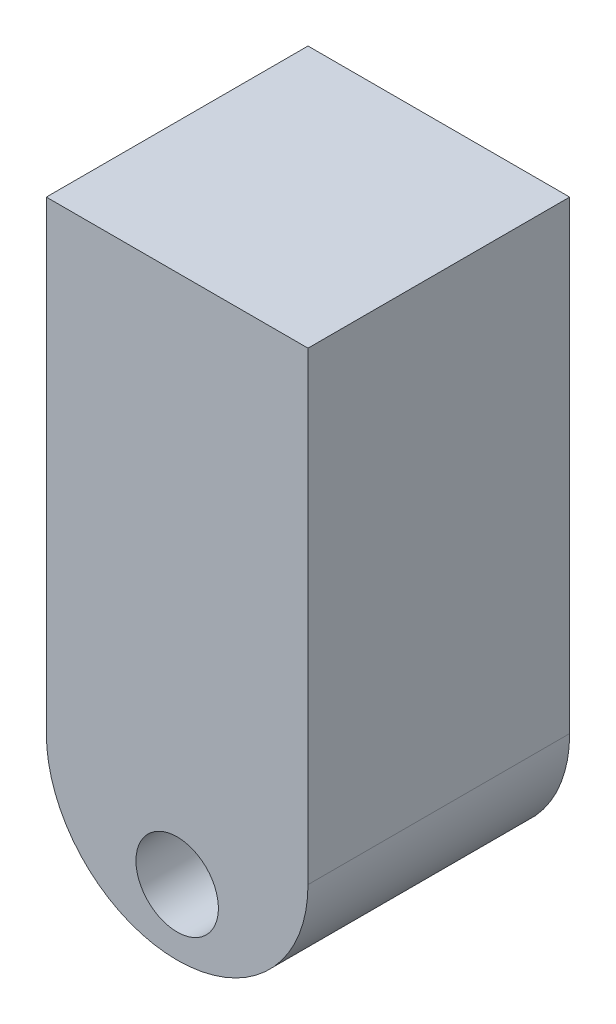
ISO-10303-21;
HEADER;
FILE_DESCRIPTION(('STEP AP214'),'2;1');
FILE_NAME('part.step','',(''),(''),'','','');
FILE_SCHEMA(('AUTOMOTIVE_DESIGN { 1 0 10303 214 1 1 1 1 }'));
ENDSEC;
DATA;
#1=APPLICATION_CONTEXT('core data for automotive mechanical design processes');
#2=APPLICATION_PROTOCOL_DEFINITION('international standard','automotive_design',2000,#1);
#3=PRODUCT_CONTEXT('',#1,'mechanical');
#4=PRODUCT('Part','Part','',(#3));
#5=PRODUCT_RELATED_PRODUCT_CATEGORY('part','',(#4));
#6=PRODUCT_DEFINITION_FORMATION('','',#4);
#7=PRODUCT_DEFINITION_CONTEXT('part definition',#1,'design');
#8=PRODUCT_DEFINITION('design','',#6,#7);
#9=PRODUCT_DEFINITION_SHAPE('','',#8);
#10=(LENGTH_UNIT() NAMED_UNIT(*) SI_UNIT(.MILLI.,.METRE.));
#11=(NAMED_UNIT(*) PLANE_ANGLE_UNIT() SI_UNIT($,.RADIAN.));
#12=(NAMED_UNIT(*) SI_UNIT($,.STERADIAN.) SOLID_ANGLE_UNIT());
#13=UNCERTAINTY_MEASURE_WITH_UNIT(LENGTH_MEASURE(1.E-05),#10,'distance_accuracy_value','');
#14=(GEOMETRIC_REPRESENTATION_CONTEXT(3) GLOBAL_UNCERTAINTY_ASSIGNED_CONTEXT((#13)) GLOBAL_UNIT_ASSIGNED_CONTEXT((#10,
#11,#12)) REPRESENTATION_CONTEXT('',''));
#15=CARTESIAN_POINT('',(0.,0.,0.));
#16=DIRECTION('',(0.,0.,1.));
#17=DIRECTION('',(1.,0.,0.));
#18=AXIS2_PLACEMENT_3D('',#15,#16,#17);
#19=CARTESIAN_POINT('',(-4.43730265788188,6.57084091920209,19.05));
#20=DIRECTION('',(0.,0.,1.));
#21=DIRECTION('',(1.,0.,0.));
#22=AXIS2_PLACEMENT_3D('',#19,#20,#21);
#23=PLANE('',#22);
#24=DIRECTION('',(0.,-1.,0.));
#25=VECTOR('',#24,1.);
#26=CARTESIAN_POINT('',(-13.9623026578819,14.9955130545651,19.05));
#27=LINE('',#26,#25);
#28=CARTESIAN_POINT('',(-13.9623026578819,40.3955130545651,19.05));
#29=VERTEX_POINT('',#28);
#30=CARTESIAN_POINT('',(-13.9623026578819,6.57084091920209,19.05));
#31=VERTEX_POINT('',#30);
#32=EDGE_CURVE('E93',#29,#31,#27,.T.);
#33=ORIENTED_EDGE('',*,*,#32,.T.);
#34=CARTESIAN_POINT('',(-4.43730265788188,6.57084091920209,19.05));
#35=DIRECTION('',(0.,0.,1.));
#36=DIRECTION('',(1.,0.,0.));
#37=AXIS2_PLACEMENT_3D('',#34,#35,#36);
#38=CIRCLE('',#37,9.525);
#39=CARTESIAN_POINT('',(5.08769734211812,6.57084091920209,19.05));
#40=VERTEX_POINT('',#39);
#41=EDGE_CURVE('E61',#31,#40,#38,.T.);
#42=ORIENTED_EDGE('',*,*,#41,.T.);
#43=DIRECTION('',(0.,1.,0.));
#44=VECTOR('',#43,1.);
#45=CARTESIAN_POINT('',(5.08769734211812,14.9955130545651,19.05));
#46=LINE('',#45,#44);
#47=CARTESIAN_POINT('',(5.08769734211812,40.3955130545651,19.05));
#48=VERTEX_POINT('',#47);
#49=EDGE_CURVE('E101',#40,#48,#46,.T.);
#50=ORIENTED_EDGE('',*,*,#49,.T.);
#51=DIRECTION('',(1.,0.,0.));
#52=VECTOR('',#51,1.);
#53=CARTESIAN_POINT('',(-13.9623026578819,40.3955130545651,19.05));
#54=LINE('',#53,#52);
#55=EDGE_CURVE('E98',#29,#48,#54,.T.);
#56=ORIENTED_EDGE('',*,*,#55,.F.);
#57=EDGE_LOOP('',(#33,#42,#50,#56));
#58=FACE_BOUND('',#57,.T.);
#59=CARTESIAN_POINT('',(-4.43730265788188,1.82006584794216,19.05));
#60=DIRECTION('',(0.,0.,1.));
#61=DIRECTION('',(1.,0.,0.));
#62=AXIS2_PLACEMENT_3D('',#59,#60,#61);
#63=CIRCLE('',#62,3.);
#64=CARTESIAN_POINT('',(-7.43730265788188,1.82006584794216,19.05));
#65=VERTEX_POINT('',#64);
#66=EDGE_CURVE('E111',#65,#65,#63,.T.);
#67=ORIENTED_EDGE('',*,*,#66,.F.);
#68=EDGE_LOOP('',(#67));
#69=FACE_BOUND('',#68,.T.);
#70=ADVANCED_FACE('F50',(#58,#69),#23,.T.);
#71=CARTESIAN_POINT('',(-4.43730265788188,6.57084091920209,0.));
#72=DIRECTION('',(0.,0.,1.));
#73=DIRECTION('',(1.,0.,0.));
#74=AXIS2_PLACEMENT_3D('',#71,#72,#73);
#75=PLANE('',#74);
#76=DIRECTION('',(0.,-1.,0.));
#77=VECTOR('',#76,1.);
#78=CARTESIAN_POINT('',(-13.9623026578819,14.9955130545651,0.));
#79=LINE('',#78,#77);
#80=CARTESIAN_POINT('',(-13.9623026578819,40.3955130545651,0.));
#81=VERTEX_POINT('',#80);
#82=CARTESIAN_POINT('',(-13.9623026578819,6.57084091920209,0.));
#83=VERTEX_POINT('',#82);
#84=EDGE_CURVE('E76',#81,#83,#79,.T.);
#85=ORIENTED_EDGE('',*,*,#84,.F.);
#86=DIRECTION('',(-1.,0.,0.));
#87=VECTOR('',#86,1.);
#88=CARTESIAN_POINT('',(-13.9623026578819,40.3955130545651,0.));
#89=LINE('',#88,#87);
#90=CARTESIAN_POINT('',(5.08769734211812,40.3955130545651,0.));
#91=VERTEX_POINT('',#90);
#92=EDGE_CURVE('E107',#91,#81,#89,.T.);
#93=ORIENTED_EDGE('',*,*,#92,.F.);
#94=DIRECTION('',(0.,1.,0.));
#95=VECTOR('',#94,1.);
#96=CARTESIAN_POINT('',(5.08769734211812,14.9955130545651,0.));
#97=LINE('',#96,#95);
#98=CARTESIAN_POINT('',(5.08769734211812,6.57084091920209,0.));
#99=VERTEX_POINT('',#98);
#100=EDGE_CURVE('E92',#99,#91,#97,.T.);
#101=ORIENTED_EDGE('',*,*,#100,.F.);
#102=CARTESIAN_POINT('',(-4.43730265788188,6.57084091920209,0.));
#103=DIRECTION('',(0.,0.,1.));
#104=DIRECTION('',(1.,0.,0.));
#105=AXIS2_PLACEMENT_3D('',#102,#103,#104);
#106=CIRCLE('',#105,9.525);
#107=EDGE_CURVE('E73',#83,#99,#106,.T.);
#108=ORIENTED_EDGE('',*,*,#107,.F.);
#109=EDGE_LOOP('',(#85,#93,#101,#108));
#110=FACE_BOUND('',#109,.T.);
#111=CARTESIAN_POINT('',(-4.43730265788188,1.82006584794216,0.));
#112=DIRECTION('',(0.,0.,1.));
#113=DIRECTION('',(1.,0.,0.));
#114=AXIS2_PLACEMENT_3D('',#111,#112,#113);
#115=CIRCLE('',#114,3.);
#116=CARTESIAN_POINT('',(-7.43730265788188,1.82006584794216,0.));
#117=VERTEX_POINT('',#116);
#118=EDGE_CURVE('E114',#117,#117,#115,.T.);
#119=ORIENTED_EDGE('',*,*,#118,.T.);
#120=EDGE_LOOP('',(#119));
#121=FACE_BOUND('',#120,.T.);
#122=ADVANCED_FACE('F130',(#110,#121),#75,.F.);
#123=CARTESIAN_POINT('',(-13.9623026578819,14.9955130545651,19.05));
#124=DIRECTION('',(1.,0.,0.));
#125=DIRECTION('',(0.,0.,-1.));
#126=AXIS2_PLACEMENT_3D('',#123,#124,#125);
#127=PLANE('',#126);
#128=ORIENTED_EDGE('',*,*,#84,.T.);
#129=DIRECTION('',(0.,0.,-1.));
#130=VECTOR('',#129,1.);
#131=CARTESIAN_POINT('',(-13.9623026578819,6.57084091920209,19.05));
#132=LINE('',#131,#130);
#133=EDGE_CURVE('E11',#31,#83,#132,.T.);
#134=ORIENTED_EDGE('',*,*,#133,.F.);
#135=ORIENTED_EDGE('',*,*,#32,.F.);
#136=DIRECTION('',(0.,0.,1.));
#137=VECTOR('',#136,1.);
#138=CARTESIAN_POINT('',(-13.9623026578819,40.3955130545651,0.));
#139=LINE('',#138,#137);
#140=EDGE_CURVE('E94',#81,#29,#139,.T.);
#141=ORIENTED_EDGE('',*,*,#140,.F.);
#142=EDGE_LOOP('',(#128,#134,#135,#141));
#143=FACE_BOUND('',#142,.T.);
#144=ADVANCED_FACE('F47',(#143),#127,.F.);
#145=CARTESIAN_POINT('',(-4.43730265788188,6.57084091920209,19.05));
#146=DIRECTION('',(0.,0.,-1.));
#147=DIRECTION('',(-1.,0.,0.));
#148=AXIS2_PLACEMENT_3D('',#145,#146,#147);
#149=CYLINDRICAL_SURFACE('',#148,9.525);
#150=ORIENTED_EDGE('',*,*,#107,.T.);
#151=DIRECTION('',(0.,0.,-1.));
#152=VECTOR('',#151,1.);
#153=CARTESIAN_POINT('',(5.08769734211812,6.57084091920209,19.05));
#154=LINE('',#153,#152);
#155=EDGE_CURVE('E57',#40,#99,#154,.T.);
#156=ORIENTED_EDGE('',*,*,#155,.F.);
#157=ORIENTED_EDGE('',*,*,#41,.F.);
#158=ORIENTED_EDGE('',*,*,#133,.T.);
#159=EDGE_LOOP('',(#150,#156,#157,#158));
#160=FACE_BOUND('',#159,.T.);
#161=ADVANCED_FACE('F145',(#160),#149,.T.);
#162=CARTESIAN_POINT('',(5.08769734211812,14.9955130545651,19.05));
#163=DIRECTION('',(-1.,0.,0.));
#164=DIRECTION('',(0.,-1.,0.));
#165=AXIS2_PLACEMENT_3D('',#162,#163,#164);
#166=PLANE('',#165);
#167=ORIENTED_EDGE('',*,*,#100,.T.);
#168=DIRECTION('',(0.,0.,-1.));
#169=VECTOR('',#168,1.);
#170=CARTESIAN_POINT('',(5.08769734211812,40.3955130545651,0.));
#171=LINE('',#170,#169);
#172=EDGE_CURVE('E104',#48,#91,#171,.T.);
#173=ORIENTED_EDGE('',*,*,#172,.F.);
#174=ORIENTED_EDGE('',*,*,#49,.F.);
#175=ORIENTED_EDGE('',*,*,#155,.T.);
#176=EDGE_LOOP('',(#167,#173,#174,#175));
#177=FACE_BOUND('',#176,.T.);
#178=ADVANCED_FACE('F124',(#177),#166,.F.);
#179=CARTESIAN_POINT('',(-4.43730265788188,1.82006584794216,19.05));
#180=DIRECTION('',(0.,0.,-1.));
#181=DIRECTION('',(-1.,0.,0.));
#182=AXIS2_PLACEMENT_3D('',#179,#180,#181);
#183=CYLINDRICAL_SURFACE('',#182,3.);
#184=CARTESIAN_POINT('',(-7.43730265788188,1.82006584794216,19.05));
#185=CARTESIAN_POINT('',(-7.43730265788188,1.82006584794216,18.8515625));
#186=CARTESIAN_POINT('',(-7.43730265788188,1.82006584794216,18.653125));
#187=CARTESIAN_POINT('',(-7.43730265788188,1.82006584794216,18.25625));
#188=CARTESIAN_POINT('',(-7.43730265788188,1.82006584794216,18.0578125));
#189=CARTESIAN_POINT('',(-7.43730265788188,1.82006584794216,17.6609375));
#190=CARTESIAN_POINT('',(-7.43730265788188,1.82006584794216,17.4625));
#191=CARTESIAN_POINT('',(-7.43730265788188,1.82006584794216,17.065625));
#192=CARTESIAN_POINT('',(-7.43730265788188,1.82006584794216,16.8671875));
#193=CARTESIAN_POINT('',(-7.43730265788188,1.82006584794216,16.4703125));
#194=CARTESIAN_POINT('',(-7.43730265788188,1.82006584794216,16.271875));
#195=CARTESIAN_POINT('',(-7.43730265788188,1.82006584794216,15.875));
#196=CARTESIAN_POINT('',(-7.43730265788188,1.82006584794216,15.6765625));
#197=CARTESIAN_POINT('',(-7.43730265788188,1.82006584794216,15.2796875));
#198=CARTESIAN_POINT('',(-7.43730265788188,1.82006584794216,15.08125));
#199=CARTESIAN_POINT('',(-7.43730265788188,1.82006584794216,14.684375));
#200=CARTESIAN_POINT('',(-7.43730265788188,1.82006584794216,14.4859375));
#201=CARTESIAN_POINT('',(-7.43730265788188,1.82006584794216,14.0890625));
#202=CARTESIAN_POINT('',(-7.43730265788188,1.82006584794216,13.890625));
#203=CARTESIAN_POINT('',(-7.43730265788188,1.82006584794216,13.49375));
#204=CARTESIAN_POINT('',(-7.43730265788188,1.82006584794216,13.2953125));
#205=CARTESIAN_POINT('',(-7.43730265788188,1.82006584794216,12.8984375));
#206=CARTESIAN_POINT('',(-7.43730265788188,1.82006584794216,12.7));
#207=CARTESIAN_POINT('',(-7.43730265788188,1.82006584794216,12.303125));
#208=CARTESIAN_POINT('',(-7.43730265788188,1.82006584794216,12.1046875));
#209=CARTESIAN_POINT('',(-7.43730265788188,1.82006584794216,11.7078125));
#210=CARTESIAN_POINT('',(-7.43730265788188,1.82006584794216,11.509375));
#211=CARTESIAN_POINT('',(-7.43730265788188,1.82006584794216,11.1125));
#212=CARTESIAN_POINT('',(-7.43730265788188,1.82006584794216,10.9140625));
#213=CARTESIAN_POINT('',(-7.43730265788188,1.82006584794216,10.5171875));
#214=CARTESIAN_POINT('',(-7.43730265788188,1.82006584794216,10.31875));
#215=CARTESIAN_POINT('',(-7.43730265788188,1.82006584794216,9.921875));
#216=CARTESIAN_POINT('',(-7.43730265788188,1.82006584794216,9.7234375));
#217=CARTESIAN_POINT('',(-7.43730265788188,1.82006584794216,9.3265625));
#218=CARTESIAN_POINT('',(-7.43730265788188,1.82006584794216,9.128125));
#219=CARTESIAN_POINT('',(-7.43730265788188,1.82006584794216,8.73125));
#220=CARTESIAN_POINT('',(-7.43730265788188,1.82006584794216,8.5328125));
#221=CARTESIAN_POINT('',(-7.43730265788188,1.82006584794216,8.1359375));
#222=CARTESIAN_POINT('',(-7.43730265788188,1.82006584794216,7.9375));
#223=CARTESIAN_POINT('',(-7.43730265788188,1.82006584794216,7.540625));
#224=CARTESIAN_POINT('',(-7.43730265788188,1.82006584794216,7.3421875));
#225=CARTESIAN_POINT('',(-7.43730265788188,1.82006584794216,6.9453125));
#226=CARTESIAN_POINT('',(-7.43730265788188,1.82006584794216,6.746875));
#227=CARTESIAN_POINT('',(-7.43730265788188,1.82006584794216,6.35));
#228=CARTESIAN_POINT('',(-7.43730265788188,1.82006584794216,6.1515625));
#229=CARTESIAN_POINT('',(-7.43730265788188,1.82006584794216,5.7546875));
#230=CARTESIAN_POINT('',(-7.43730265788188,1.82006584794216,5.55625));
#231=CARTESIAN_POINT('',(-7.43730265788188,1.82006584794216,5.159375));
#232=CARTESIAN_POINT('',(-7.43730265788188,1.82006584794216,4.9609375));
#233=CARTESIAN_POINT('',(-7.43730265788188,1.82006584794216,4.5640625));
#234=CARTESIAN_POINT('',(-7.43730265788188,1.82006584794216,4.365625));
#235=CARTESIAN_POINT('',(-7.43730265788188,1.82006584794216,3.96875));
#236=CARTESIAN_POINT('',(-7.43730265788188,1.82006584794216,3.7703125));
#237=CARTESIAN_POINT('',(-7.43730265788188,1.82006584794216,3.3734375));
#238=CARTESIAN_POINT('',(-7.43730265788188,1.82006584794216,3.175));
#239=CARTESIAN_POINT('',(-7.43730265788188,1.82006584794216,2.778125));
#240=CARTESIAN_POINT('',(-7.43730265788188,1.82006584794216,2.5796875));
#241=CARTESIAN_POINT('',(-7.43730265788188,1.82006584794216,2.1828125));
#242=CARTESIAN_POINT('',(-7.43730265788188,1.82006584794216,1.984375));
#243=CARTESIAN_POINT('',(-7.43730265788188,1.82006584794216,1.5875));
#244=CARTESIAN_POINT('',(-7.43730265788188,1.82006584794216,1.3890625));
#245=CARTESIAN_POINT('',(-7.43730265788188,1.82006584794216,0.992187500000001));
#246=CARTESIAN_POINT('',(-7.43730265788188,1.82006584794216,0.793750000000001));
#247=CARTESIAN_POINT('',(-7.43730265788188,1.82006584794216,0.396875));
#248=CARTESIAN_POINT('',(-7.43730265788188,1.82006584794216,0.1984375));
#249=CARTESIAN_POINT('',(-7.43730265788188,1.82006584794216,0.));
#250=B_SPLINE_CURVE_WITH_KNOTS('',3,(#184,#185,#186,#187,#188,#189,#190,#191,#192,#193,#194,
#195,#196,#197,#198,#199,#200,#201,#202,#203,#204,#205,#206,#207,#208,#209,#210,#211,#212,#213,
#214,#215,#216,#217,#218,#219,#220,#221,#222,#223,#224,#225,#226,#227,#228,#229,#230,#231,#232,
#233,#234,#235,#236,#237,#238,#239,#240,#241,#242,#243,#244,#245,#246,#247,#248,#249),
.UNSPECIFIED.,.F.,.F.,(4,2,2,2,2,2,2,2,2,2,2,2,2,2,2,2,2,2,2,2,2,2,2,2,2,2,2,2,2,2,2,2,4),(0.,
0.5953125,1.190625,1.7859375,2.38125,2.9765625,3.571875,4.1671875,4.7625,5.3578125,5.953125,
6.5484375,7.14375,7.7390625,8.334375,8.9296875,9.525,10.1203125,10.715625,11.3109375,11.90625,
12.5015625,13.096875,13.6921875,14.2875,14.8828125,15.478125,16.0734375,16.66875,17.2640625,
17.859375,18.4546875,19.05),.UNSPECIFIED.);
#251=EDGE_CURVE('BSEAM134',#65,#117,#250,.T.);
#252=ORIENTED_EDGE('',*,*,#66,.T.);
#253=ORIENTED_EDGE('',*,*,#118,.F.);
#254=ORIENTED_EDGE('',*,*,#251,.T.);
#255=ORIENTED_EDGE('',*,*,#251,.F.);
#256=EDGE_LOOP('',(#252,#254,#253,#255));
#257=FACE_BOUND('',#256,.T.);
#258=ADVANCED_FACE('F134',(#257),#183,.F.);
#259=CARTESIAN_POINT('',(0.,40.3955130545651,0.));
#260=DIRECTION('',(0.,1.,0.));
#261=DIRECTION('',(0.,0.,1.));
#262=AXIS2_PLACEMENT_3D('',#259,#260,#261);
#263=PLANE('',#262);
#264=ORIENTED_EDGE('',*,*,#140,.T.);
#265=ORIENTED_EDGE('',*,*,#55,.T.);
#266=ORIENTED_EDGE('',*,*,#172,.T.);
#267=ORIENTED_EDGE('',*,*,#92,.T.);
#268=EDGE_LOOP('',(#264,#265,#266,#267));
#269=FACE_BOUND('',#268,.T.);
#270=ADVANCED_FACE('F110',(#269),#263,.T.);
#271=CLOSED_SHELL('',(#70,#122,#144,#161,#178,#258,#270));
#272=MANIFOLD_SOLID_BREP('B2',#271);
#273=ADVANCED_BREP_SHAPE_REPRESENTATION('',(#18,#272),#14);
#274=SHAPE_DEFINITION_REPRESENTATION(#9,#273);
ENDSEC;
END-ISO-10303-21;
